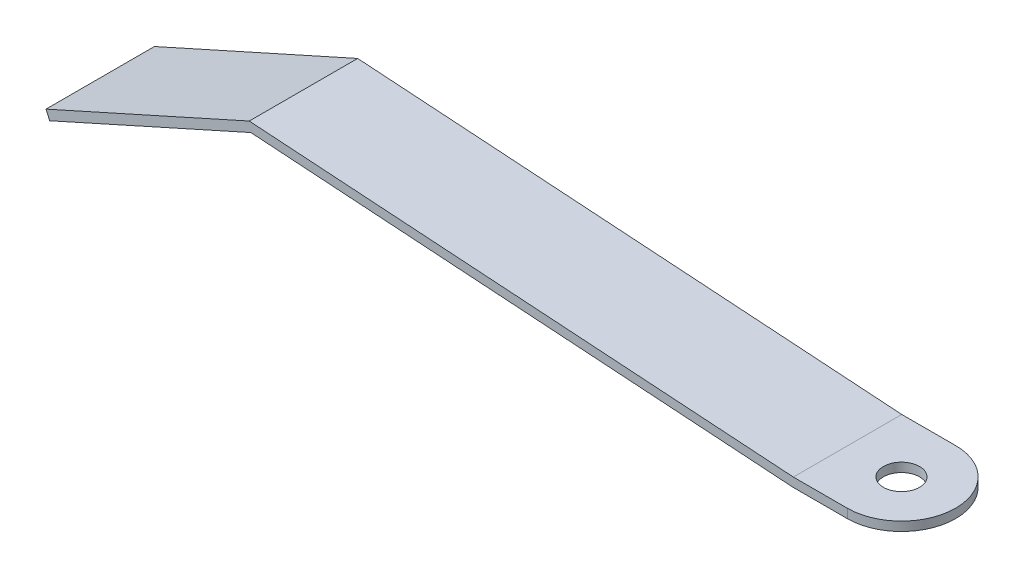
ISO-10303-21;
HEADER;
FILE_DESCRIPTION(('STEP AP214'),'2;1');
FILE_NAME('part.step','',(''),(''),'','','');
FILE_SCHEMA(('AUTOMOTIVE_DESIGN { 1 0 10303 214 1 1 1 1 }'));
ENDSEC;
DATA;
#1=APPLICATION_CONTEXT('core data for automotive mechanical design processes');
#2=APPLICATION_PROTOCOL_DEFINITION('international standard','automotive_design',2000,#1);
#3=PRODUCT_CONTEXT('',#1,'mechanical');
#4=PRODUCT('Part','Part','',(#3));
#5=PRODUCT_RELATED_PRODUCT_CATEGORY('part','',(#4));
#6=PRODUCT_DEFINITION_FORMATION('','',#4);
#7=PRODUCT_DEFINITION_CONTEXT('part definition',#1,'design');
#8=PRODUCT_DEFINITION('design','',#6,#7);
#9=PRODUCT_DEFINITION_SHAPE('','',#8);
#10=(LENGTH_UNIT() NAMED_UNIT(*) SI_UNIT(.MILLI.,.METRE.));
#11=(NAMED_UNIT(*) PLANE_ANGLE_UNIT() SI_UNIT($,.RADIAN.));
#12=(NAMED_UNIT(*) SI_UNIT($,.STERADIAN.) SOLID_ANGLE_UNIT());
#13=UNCERTAINTY_MEASURE_WITH_UNIT(LENGTH_MEASURE(1.E-05),#10,'distance_accuracy_value','');
#14=(GEOMETRIC_REPRESENTATION_CONTEXT(3) GLOBAL_UNCERTAINTY_ASSIGNED_CONTEXT((#13)) GLOBAL_UNIT_ASSIGNED_CONTEXT((#10,
#11,#12)) REPRESENTATION_CONTEXT('',''));
#15=CARTESIAN_POINT('',(0.,0.,0.));
#16=DIRECTION('',(0.,0.,1.));
#17=DIRECTION('',(1.,0.,0.));
#18=AXIS2_PLACEMENT_3D('',#15,#16,#17);
#19=CARTESIAN_POINT('',(-3.,0.,3.));
#20=DIRECTION('',(0.,-1.,0.));
#21=DIRECTION('',(1.,0.,0.));
#22=AXIS2_PLACEMENT_3D('',#19,#20,#21);
#23=CYLINDRICAL_SURFACE('',#22,3.);
#24=DIRECTION('',(0.,1.,0.));
#25=VECTOR('',#24,1.);
#26=CARTESIAN_POINT('',(-3.,0.,6.));
#27=LINE('',#26,#25);
#28=CARTESIAN_POINT('',(-3.,0.,6.));
#29=VERTEX_POINT('',#28);
#30=CARTESIAN_POINT('',(-3.,0.5,6.));
#31=VERTEX_POINT('',#30);
#32=EDGE_CURVE('E117',#29,#31,#27,.T.);
#33=ORIENTED_EDGE('',*,*,#32,.F.);
#34=CARTESIAN_POINT('',(-3.,0.,3.));
#35=DIRECTION('',(0.,-1.,0.));
#36=DIRECTION('',(1.,0.,0.));
#37=AXIS2_PLACEMENT_3D('',#34,#35,#36);
#38=CIRCLE('',#37,3.);
#39=CARTESIAN_POINT('',(-3.,0.,0.));
#40=VERTEX_POINT('',#39);
#41=EDGE_CURVE('E40',#40,#29,#38,.T.);
#42=ORIENTED_EDGE('',*,*,#41,.F.);
#43=DIRECTION('',(0.,-1.,0.));
#44=VECTOR('',#43,1.);
#45=CARTESIAN_POINT('',(-3.,0.,0.));
#46=LINE('',#45,#44);
#47=CARTESIAN_POINT('',(-3.,0.5,0.));
#48=VERTEX_POINT('',#47);
#49=EDGE_CURVE('E162',#48,#40,#46,.T.);
#50=ORIENTED_EDGE('',*,*,#49,.F.);
#51=CARTESIAN_POINT('',(-3.,0.5,3.));
#52=DIRECTION('',(0.,-1.,0.));
#53=DIRECTION('',(1.,0.,0.));
#54=AXIS2_PLACEMENT_3D('',#51,#52,#53);
#55=CIRCLE('',#54,3.);
#56=EDGE_CURVE('E11',#31,#48,#55,.F.);
#57=ORIENTED_EDGE('',*,*,#56,.F.);
#58=EDGE_LOOP('',(#33,#42,#50,#57));
#59=FACE_BOUND('',#58,.T.);
#60=ADVANCED_FACE('F33',(#59),#23,.T.);
#61=CARTESIAN_POINT('',(-36.2048494785811,2.45611039357271,6.));
#62=DIRECTION('',(0.409698957162187,-0.912220787145424,0.));
#63=DIRECTION('',(0.912220787145424,0.409698957162187,0.));
#64=AXIS2_PLACEMENT_3D('',#61,#62,#63);
#65=PLANE('',#64);
#66=DIRECTION('',(-0.912220787145424,-0.409698957162187,0.));
#67=VECTOR('',#66,1.);
#68=CARTESIAN_POINT('',(-36.2048494785811,2.45611039357271,0.));
#69=LINE('',#68,#67);
#70=CARTESIAN_POINT('',(-36.0911283850756,2.5071851049508,0.));
#71=VERTEX_POINT('',#70);
#72=CARTESIAN_POINT('',(-47.3376675050656,-2.54388960642729,0.));
#73=VERTEX_POINT('',#72);
#74=EDGE_CURVE('E113',#71,#73,#69,.T.);
#75=ORIENTED_EDGE('',*,*,#74,.T.);
#76=DIRECTION('',(0.,0.,-1.));
#77=VECTOR('',#76,1.);
#78=CARTESIAN_POINT('',(-47.3376675050656,-2.54388960642729,6.));
#79=LINE('',#78,#77);
#80=CARTESIAN_POINT('',(-47.3376675050656,-2.54388960642729,6.));
#81=VERTEX_POINT('',#80);
#82=EDGE_CURVE('E110',#81,#73,#79,.T.);
#83=ORIENTED_EDGE('',*,*,#82,.F.);
#84=DIRECTION('',(-0.912220787145424,-0.409698957162187,0.));
#85=VECTOR('',#84,1.);
#86=CARTESIAN_POINT('',(-36.2048494785811,2.45611039357271,6.));
#87=LINE('',#86,#85);
#88=CARTESIAN_POINT('',(-36.0911283850756,2.5071851049508,6.));
#89=VERTEX_POINT('',#88);
#90=EDGE_CURVE('E94',#89,#81,#87,.T.);
#91=ORIENTED_EDGE('',*,*,#90,.F.);
#92=DIRECTION('',(0.,0.,-1.));
#93=VECTOR('',#92,1.);
#94=CARTESIAN_POINT('',(-36.0911283850756,2.5071851049508,6.));
#95=LINE('',#94,#93);
#96=EDGE_CURVE('E134',#89,#71,#95,.T.);
#97=ORIENTED_EDGE('',*,*,#96,.T.);
#98=EDGE_LOOP('',(#75,#83,#91,#97));
#99=FACE_BOUND('',#98,.T.);
#100=ADVANCED_FACE('F111',(#99),#65,.F.);
#101=CARTESIAN_POINT('',(-47.1328180264846,-3.,6.));
#102=DIRECTION('',(-0.912220787145425,-0.409698957162184,0.));
#103=DIRECTION('',(0.409698957162184,-0.912220787145425,0.));
#104=AXIS2_PLACEMENT_3D('',#101,#102,#103);
#105=PLANE('',#104);
#106=DIRECTION('',(-0.409698957162184,0.912220787145425,0.));
#107=VECTOR('',#106,1.);
#108=CARTESIAN_POINT('',(-47.1328180264846,-3.,0.));
#109=LINE('',#108,#107);
#110=CARTESIAN_POINT('',(-47.1328180264846,-3.,0.));
#111=VERTEX_POINT('',#110);
#112=EDGE_CURVE('E136',#111,#73,#109,.T.);
#113=ORIENTED_EDGE('',*,*,#112,.F.);
#114=DIRECTION('',(0.,0.,-1.));
#115=VECTOR('',#114,1.);
#116=CARTESIAN_POINT('',(-47.1328180264846,-3.,6.));
#117=LINE('',#116,#115);
#118=CARTESIAN_POINT('',(-47.1328180264846,-3.,6.));
#119=VERTEX_POINT('',#118);
#120=EDGE_CURVE('E118',#119,#111,#117,.T.);
#121=ORIENTED_EDGE('',*,*,#120,.F.);
#122=DIRECTION('',(-0.409698957162184,0.912220787145425,0.));
#123=VECTOR('',#122,1.);
#124=CARTESIAN_POINT('',(-47.1328180264846,-3.,6.));
#125=LINE('',#124,#123);
#126=EDGE_CURVE('E100',#119,#81,#125,.T.);
#127=ORIENTED_EDGE('',*,*,#126,.T.);
#128=ORIENTED_EDGE('',*,*,#82,.T.);
#129=EDGE_LOOP('',(#113,#121,#127,#128));
#130=FACE_BOUND('',#129,.T.);
#131=ADVANCED_FACE('F120',(#130),#105,.T.);
#132=CARTESIAN_POINT('',(-36.,2.,6.));
#133=DIRECTION('',(0.409698957162187,-0.912220787145424,0.));
#134=DIRECTION('',(0.912220787145424,0.409698957162187,0.));
#135=AXIS2_PLACEMENT_3D('',#132,#133,#134);
#136=PLANE('',#135);
#137=DIRECTION('',(-0.912220787145424,-0.409698957162187,0.));
#138=VECTOR('',#137,1.);
#139=CARTESIAN_POINT('',(-36.,2.,0.));
#140=LINE('',#139,#138);
#141=CARTESIAN_POINT('',(-36.,2.,0.));
#142=VERTEX_POINT('',#141);
#143=EDGE_CURVE('E139',#142,#111,#140,.T.);
#144=ORIENTED_EDGE('',*,*,#143,.F.);
#145=DIRECTION('',(0.,0.,-1.));
#146=VECTOR('',#145,1.);
#147=CARTESIAN_POINT('',(-36.,2.,6.));
#148=LINE('',#147,#146);
#149=CARTESIAN_POINT('',(-36.,2.,6.));
#150=VERTEX_POINT('',#149);
#151=EDGE_CURVE('E157',#150,#142,#148,.T.);
#152=ORIENTED_EDGE('',*,*,#151,.F.);
#153=DIRECTION('',(-0.912220787145424,-0.409698957162187,0.));
#154=VECTOR('',#153,1.);
#155=CARTESIAN_POINT('',(-36.,2.,6.));
#156=LINE('',#155,#154);
#157=EDGE_CURVE('E121',#150,#119,#156,.T.);
#158=ORIENTED_EDGE('',*,*,#157,.T.);
#159=ORIENTED_EDGE('',*,*,#120,.T.);
#160=EDGE_LOOP('',(#144,#152,#158,#159));
#161=FACE_BOUND('',#160,.T.);
#162=ADVANCED_FACE('F197',(#161),#136,.T.);
#163=CARTESIAN_POINT('',(-6.,0.,6.));
#164=DIRECTION('',(-0.0665190105237738,-0.997785157856609,0.));
#165=DIRECTION('',(0.997785157856609,-0.0665190105237738,0.));
#166=AXIS2_PLACEMENT_3D('',#163,#164,#165);
#167=PLANE('',#166);
#168=DIRECTION('',(-0.997785157856609,0.0665190105237738,0.));
#169=VECTOR('',#168,1.);
#170=CARTESIAN_POINT('',(-6.,0.,0.));
#171=LINE('',#170,#169);
#172=CARTESIAN_POINT('',(-6.,0.,0.));
#173=VERTEX_POINT('',#172);
#174=EDGE_CURVE('E142',#173,#142,#171,.T.);
#175=ORIENTED_EDGE('',*,*,#174,.F.);
#176=DIRECTION('',(0.,0.,-1.));
#177=VECTOR('',#176,1.);
#178=CARTESIAN_POINT('',(-6.,0.,6.));
#179=LINE('',#178,#177);
#180=CARTESIAN_POINT('',(-6.,0.,6.));
#181=VERTEX_POINT('',#180);
#182=EDGE_CURVE('E154',#181,#173,#179,.T.);
#183=ORIENTED_EDGE('',*,*,#182,.F.);
#184=DIRECTION('',(-0.997785157856609,0.0665190105237738,0.));
#185=VECTOR('',#184,1.);
#186=CARTESIAN_POINT('',(-6.,0.,6.));
#187=LINE('',#186,#185);
#188=EDGE_CURVE('E123',#181,#150,#187,.T.);
#189=ORIENTED_EDGE('',*,*,#188,.T.);
#190=ORIENTED_EDGE('',*,*,#151,.T.);
#191=EDGE_LOOP('',(#175,#183,#189,#190));
#192=FACE_BOUND('',#191,.T.);
#193=ADVANCED_FACE('F170',(#192),#167,.T.);
#194=CARTESIAN_POINT('',(0.,0.,6.));
#195=DIRECTION('',(0.,-1.,0.));
#196=DIRECTION('',(1.,0.,0.));
#197=AXIS2_PLACEMENT_3D('',#194,#195,#196);
#198=PLANE('',#197);
#199=CARTESIAN_POINT('',(-3.,0.,3.));
#200=DIRECTION('',(0.,-1.,0.));
#201=DIRECTION('',(1.,0.,0.));
#202=AXIS2_PLACEMENT_3D('',#199,#200,#201);
#203=CIRCLE('',#202,0.999999999999999);
#204=CARTESIAN_POINT('',(-2.,0.,3.));
#205=VERTEX_POINT('',#204);
#206=EDGE_CURVE('E137',#205,#205,#203,.T.);
#207=ORIENTED_EDGE('',*,*,#206,.F.);
#208=EDGE_LOOP('',(#207));
#209=FACE_BOUND('',#208,.T.);
#210=DIRECTION('',(-1.,0.,0.));
#211=VECTOR('',#210,1.);
#212=CARTESIAN_POINT('',(0.,0.,0.));
#213=LINE('',#212,#211);
#214=EDGE_CURVE('E145',#40,#173,#213,.T.);
#215=ORIENTED_EDGE('',*,*,#214,.F.);
#216=ORIENTED_EDGE('',*,*,#41,.T.);
#217=DIRECTION('',(-1.,0.,0.));
#218=VECTOR('',#217,1.);
#219=CARTESIAN_POINT('',(0.,0.,6.));
#220=LINE('',#219,#218);
#221=EDGE_CURVE('E129',#29,#181,#220,.T.);
#222=ORIENTED_EDGE('',*,*,#221,.T.);
#223=ORIENTED_EDGE('',*,*,#182,.T.);
#224=EDGE_LOOP('',(#215,#216,#222,#223));
#225=FACE_BOUND('',#224,.T.);
#226=ADVANCED_FACE('F165',(#209,#225),#198,.T.);
#227=CARTESIAN_POINT('',(0.,0.5,6.));
#228=DIRECTION('',(0.,-1.,0.));
#229=DIRECTION('',(1.,0.,0.));
#230=AXIS2_PLACEMENT_3D('',#227,#228,#229);
#231=PLANE('',#230);
#232=CARTESIAN_POINT('',(-3.,0.5,3.));
#233=DIRECTION('',(0.,1.,0.));
#234=DIRECTION('',(0.,0.,1.));
#235=AXIS2_PLACEMENT_3D('',#232,#233,#234);
#236=CIRCLE('',#235,1.);
#237=CARTESIAN_POINT('',(-3.,0.5,4.));
#238=VERTEX_POINT('',#237);
#239=EDGE_CURVE('E212',#238,#238,#236,.T.);
#240=ORIENTED_EDGE('',*,*,#239,.F.);
#241=EDGE_LOOP('',(#240));
#242=FACE_BOUND('',#241,.T.);
#243=DIRECTION('',(-1.,0.,0.));
#244=VECTOR('',#243,1.);
#245=CARTESIAN_POINT('',(0.,0.5,6.));
#246=LINE('',#245,#244);
#247=CARTESIAN_POINT('',(-5.98335181081355,0.499999999999999,6.));
#248=VERTEX_POINT('',#247);
#249=EDGE_CURVE('E131',#31,#248,#246,.T.);
#250=ORIENTED_EDGE('',*,*,#249,.F.);
#251=ORIENTED_EDGE('',*,*,#56,.T.);
#252=DIRECTION('',(-1.,0.,0.));
#253=VECTOR('',#252,1.);
#254=CARTESIAN_POINT('',(0.,0.5,0.));
#255=LINE('',#254,#253);
#256=CARTESIAN_POINT('',(-5.98335181081355,0.499999999999999,0.));
#257=VERTEX_POINT('',#256);
#258=EDGE_CURVE('E147',#48,#257,#255,.T.);
#259=ORIENTED_EDGE('',*,*,#258,.T.);
#260=DIRECTION('',(0.,0.,-1.));
#261=VECTOR('',#260,1.);
#262=CARTESIAN_POINT('',(-5.98335181081355,0.499999999999999,6.));
#263=LINE('',#262,#261);
#264=EDGE_CURVE('E151',#248,#257,#263,.T.);
#265=ORIENTED_EDGE('',*,*,#264,.F.);
#266=EDGE_LOOP('',(#250,#251,#259,#265));
#267=FACE_BOUND('',#266,.T.);
#268=ADVANCED_FACE('F177',(#242,#267),#231,.F.);
#269=CARTESIAN_POINT('',(-5.96674049473811,0.498892578928304,6.));
#270=DIRECTION('',(-0.0665190105237738,-0.997785157856609,0.));
#271=DIRECTION('',(0.997785157856609,-0.0665190105237738,0.));
#272=AXIS2_PLACEMENT_3D('',#269,#270,#271);
#273=PLANE('',#272);
#274=DIRECTION('',(-0.997785157856609,0.0665190105237738,0.));
#275=VECTOR('',#274,1.);
#276=CARTESIAN_POINT('',(-5.96674049473811,0.498892578928304,0.));
#277=LINE('',#276,#275);
#278=EDGE_CURVE('E107',#257,#71,#277,.T.);
#279=ORIENTED_EDGE('',*,*,#278,.T.);
#280=ORIENTED_EDGE('',*,*,#96,.F.);
#281=DIRECTION('',(-0.997785157856609,0.0665190105237738,0.));
#282=VECTOR('',#281,1.);
#283=CARTESIAN_POINT('',(-5.96674049473811,0.498892578928304,6.));
#284=LINE('',#283,#282);
#285=EDGE_CURVE('E103',#248,#89,#284,.T.);
#286=ORIENTED_EDGE('',*,*,#285,.F.);
#287=ORIENTED_EDGE('',*,*,#264,.T.);
#288=EDGE_LOOP('',(#279,#280,#286,#287));
#289=FACE_BOUND('',#288,.T.);
#290=ADVANCED_FACE('F179',(#289),#273,.F.);
#291=CARTESIAN_POINT('',(0.,0.,6.));
#292=DIRECTION('',(0.,0.,-1.));
#293=DIRECTION('',(-1.,0.,0.));
#294=AXIS2_PLACEMENT_3D('',#291,#292,#293);
#295=PLANE('',#294);
#296=ORIENTED_EDGE('',*,*,#221,.F.);
#297=ORIENTED_EDGE('',*,*,#32,.T.);
#298=ORIENTED_EDGE('',*,*,#249,.T.);
#299=ORIENTED_EDGE('',*,*,#285,.T.);
#300=ORIENTED_EDGE('',*,*,#90,.T.);
#301=ORIENTED_EDGE('',*,*,#126,.F.);
#302=ORIENTED_EDGE('',*,*,#157,.F.);
#303=ORIENTED_EDGE('',*,*,#188,.F.);
#304=EDGE_LOOP('',(#296,#297,#298,#299,#300,#301,#302,#303));
#305=FACE_BOUND('',#304,.T.);
#306=ADVANCED_FACE('F97',(#305),#295,.F.);
#307=CARTESIAN_POINT('',(0.,0.,0.));
#308=DIRECTION('',(0.,0.,-1.));
#309=DIRECTION('',(-1.,0.,0.));
#310=AXIS2_PLACEMENT_3D('',#307,#308,#309);
#311=PLANE('',#310);
#312=ORIENTED_EDGE('',*,*,#258,.F.);
#313=ORIENTED_EDGE('',*,*,#49,.T.);
#314=ORIENTED_EDGE('',*,*,#214,.T.);
#315=ORIENTED_EDGE('',*,*,#174,.T.);
#316=ORIENTED_EDGE('',*,*,#143,.T.);
#317=ORIENTED_EDGE('',*,*,#112,.T.);
#318=ORIENTED_EDGE('',*,*,#74,.F.);
#319=ORIENTED_EDGE('',*,*,#278,.F.);
#320=EDGE_LOOP('',(#312,#313,#314,#315,#316,#317,#318,#319));
#321=FACE_BOUND('',#320,.T.);
#322=ADVANCED_FACE('F174',(#321),#311,.T.);
#323=CARTESIAN_POINT('',(-3.,0.5,3.));
#324=DIRECTION('',(0.,1.,0.));
#325=DIRECTION('',(0.,0.,1.));
#326=AXIS2_PLACEMENT_3D('',#323,#324,#325);
#327=CYLINDRICAL_SURFACE('',#326,0.999999999999999);
#328=ORIENTED_EDGE('',*,*,#206,.T.);
#329=EDGE_LOOP('',(#328));
#330=FACE_BOUND('',#329,.T.);
#331=ORIENTED_EDGE('',*,*,#239,.T.);
#332=EDGE_LOOP('',(#331));
#333=FACE_BOUND('',#332,.T.);
#334=ADVANCED_FACE('F217',(#330,#333),#327,.F.);
#335=CLOSED_SHELL('',(#60,#100,#131,#162,#193,#226,#268,#290,#306,#322,#334));
#336=MANIFOLD_SOLID_BREP('B2',#335);
#337=ADVANCED_BREP_SHAPE_REPRESENTATION('',(#18,#336),#14);
#338=SHAPE_DEFINITION_REPRESENTATION(#9,#337);
ENDSEC;
END-ISO-10303-21;
